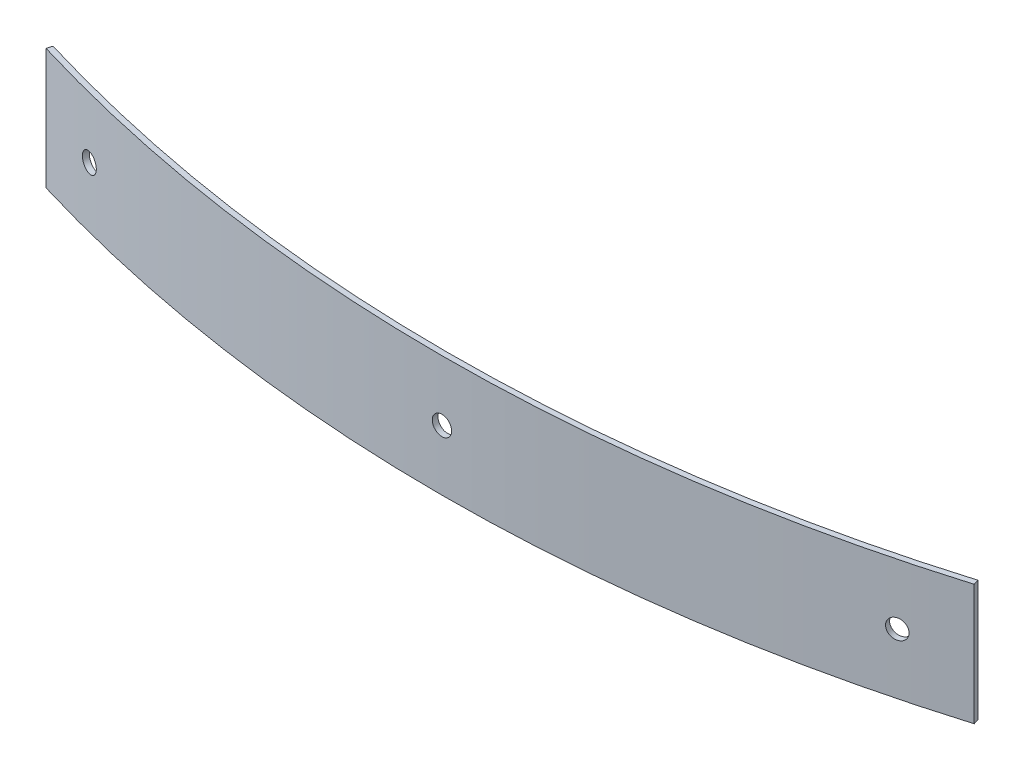
ISO-10303-21;
HEADER;
FILE_DESCRIPTION(('STEP AP214'),'2;1');
FILE_NAME('part.step','',(''),(''),'','','');
FILE_SCHEMA(('AUTOMOTIVE_DESIGN { 1 0 10303 214 1 1 1 1 }'));
ENDSEC;
DATA;
#1=APPLICATION_CONTEXT('core data for automotive mechanical design processes');
#2=APPLICATION_PROTOCOL_DEFINITION('international standard','automotive_design',2000,#1);
#3=PRODUCT_CONTEXT('',#1,'mechanical');
#4=PRODUCT('Part','Part','',(#3));
#5=PRODUCT_RELATED_PRODUCT_CATEGORY('part','',(#4));
#6=PRODUCT_DEFINITION_FORMATION('','',#4);
#7=PRODUCT_DEFINITION_CONTEXT('part definition',#1,'design');
#8=PRODUCT_DEFINITION('design','',#6,#7);
#9=PRODUCT_DEFINITION_SHAPE('','',#8);
#10=(LENGTH_UNIT() NAMED_UNIT(*) SI_UNIT(.MILLI.,.METRE.));
#11=(NAMED_UNIT(*) PLANE_ANGLE_UNIT() SI_UNIT($,.RADIAN.));
#12=(NAMED_UNIT(*) SI_UNIT($,.STERADIAN.) SOLID_ANGLE_UNIT());
#13=UNCERTAINTY_MEASURE_WITH_UNIT(LENGTH_MEASURE(1.E-05),#10,'distance_accuracy_value','');
#14=(GEOMETRIC_REPRESENTATION_CONTEXT(3) GLOBAL_UNCERTAINTY_ASSIGNED_CONTEXT((#13)) GLOBAL_UNIT_ASSIGNED_CONTEXT((#10,
#11,#12)) REPRESENTATION_CONTEXT('',''));
#15=CARTESIAN_POINT('',(0.,0.,0.));
#16=DIRECTION('',(0.,0.,1.));
#17=DIRECTION('',(1.,0.,0.));
#18=AXIS2_PLACEMENT_3D('',#15,#16,#17);
#19=CARTESIAN_POINT('',(0.,379.222,-237.572238635431));
#20=DIRECTION('',(0.,1.,0.));
#21=DIRECTION('',(0.,0.,1.));
#22=AXIS2_PLACEMENT_3D('',#19,#20,#21);
#23=CYLINDRICAL_SURFACE('',#22,253.492);
#24=DIRECTION('',(0.,1.,0.));
#25=VECTOR('',#24,1.);
#26=CARTESIAN_POINT('',(72.9153494369118,379.222,5.20656167566133));
#27=LINE('',#26,#25);
#28=CARTESIAN_POINT('',(72.9153494369118,377.952,5.20656167566136));
#29=VERTEX_POINT('',#28);
#30=CARTESIAN_POINT('',(72.9153494369118,397.002,5.20656167566136));
#31=VERTEX_POINT('',#30);
#32=EDGE_CURVE('E171',#29,#31,#27,.T.);
#33=ORIENTED_EDGE('',*,*,#32,.F.);
#34=CARTESIAN_POINT('',(0.,377.952,-237.572238635431));
#35=DIRECTION('',(0.,1.,0.));
#36=DIRECTION('',(0.,0.,1.));
#37=AXIS2_PLACEMENT_3D('',#34,#35,#36);
#38=CIRCLE('',#37,253.492);
#39=CARTESIAN_POINT('',(-72.9153494369118,377.952,5.2065616756613));
#40=VERTEX_POINT('',#39);
#41=EDGE_CURVE('E46',#29,#40,#38,.F.);
#42=ORIENTED_EDGE('',*,*,#41,.T.);
#43=DIRECTION('',(0.,1.,0.));
#44=VECTOR('',#43,1.);
#45=CARTESIAN_POINT('',(-72.9153494369118,379.222,5.20656167566128));
#46=LINE('',#45,#44);
#47=CARTESIAN_POINT('',(-72.9153494369118,397.002,5.20656167566129));
#48=VERTEX_POINT('',#47);
#49=EDGE_CURVE('E168',#48,#40,#46,.F.);
#50=ORIENTED_EDGE('',*,*,#49,.F.);
#51=CARTESIAN_POINT('',(0.,397.002,-237.572238635431));
#52=DIRECTION('',(0.,1.,0.));
#53=DIRECTION('',(0.,0.,1.));
#54=AXIS2_PLACEMENT_3D('',#51,#52,#53);
#55=CIRCLE('',#54,253.492);
#56=EDGE_CURVE('E92',#31,#48,#55,.F.);
#57=ORIENTED_EDGE('',*,*,#56,.F.);
#58=EDGE_LOOP('',(#33,#42,#50,#57));
#59=FACE_BOUND('',#58,.T.);
#60=CARTESIAN_POINT('',(61.9927239420261,387.477,8.22258686390276));
#61=CARTESIAN_POINT('',(61.9927276324017,387.39139708093,8.22258597349928));
#62=CARTESIAN_POINT('',(61.9997410726376,387.305732111379,8.22081738039946));
#63=CARTESIAN_POINT('',(62.0276208205093,387.136761487185,8.21378317638302));
#64=CARTESIAN_POINT('',(62.0485037971088,387.053458797391,8.2085133575505));
#65=CARTESIAN_POINT('',(62.1035253656771,386.891685141121,8.19461633429835));
#66=CARTESIAN_POINT('',(62.1376576200432,386.813211885316,8.18599073506389));
#67=CARTESIAN_POINT('',(62.2181960158537,386.663311563657,8.16561328312497));
#68=CARTESIAN_POINT('',(62.2645991075236,386.591882753035,8.15386220721735));
#69=CARTESIAN_POINT('',(62.3683668540975,386.458065414065,8.12754511857903));
#70=CARTESIAN_POINT('',(62.4257327791689,386.395677934731,8.11297877966625));
#71=CARTESIAN_POINT('',(62.5497913954779,386.281722566038,8.08142355628616));
#72=CARTESIAN_POINT('',(62.616484453025,386.230155101819,8.06443457667265));
#73=CARTESIAN_POINT('',(62.7572963259186,386.139307020066,8.02849648899902));
#74=CARTESIAN_POINT('',(62.831415059135,386.100026266657,8.00954740261817));
#75=CARTESIAN_POINT('',(62.9849702773748,386.034866079362,7.9702095451716));
#76=CARTESIAN_POINT('',(63.0644067512782,386.008986617453,7.94982077711642));
#77=CARTESIAN_POINT('',(63.2263385727789,385.971363790488,7.90817027727855));
#78=CARTESIAN_POINT('',(63.3088338887046,385.959620279108,7.88690855453432));
#79=CARTESIAN_POINT('',(63.4745406703869,385.950602284758,7.84410978566991));
#80=CARTESIAN_POINT('',(63.5577521347898,385.953327774444,7.82257274007012));
#81=CARTESIAN_POINT('',(63.7225284829729,385.973170212463,7.77983629795129));
#82=CARTESIAN_POINT('',(63.804093387423,385.990286980022,7.75863689719434));
#83=CARTESIAN_POINT('',(63.9632645829819,386.038425824335,7.7171855477871));
#84=CARTESIAN_POINT('',(64.0408708697292,386.06944791641,7.69693360018068));
#85=CARTESIAN_POINT('',(64.1899259961113,386.144516989797,7.6579662856998));
#86=CARTESIAN_POINT('',(64.261374797254,386.188564052524,7.63925092843099));
#87=CARTESIAN_POINT('',(64.396091145886,386.288432621804,7.60390695589148));
#88=CARTESIAN_POINT('',(64.4593586958026,386.344254124864,7.58727834000163));
#89=CARTESIAN_POINT('',(64.5759231023959,386.466088040076,7.55660067272226));
#90=CARTESIAN_POINT('',(64.6292197999315,386.532100614852,7.54255166250497));
#91=CARTESIAN_POINT('',(64.724333778936,386.672442206264,7.51745333146019));
#92=CARTESIAN_POINT('',(64.7661510588925,386.746771223995,7.50640401102786));
#93=CARTESIAN_POINT('',(64.8371239029614,386.901635799182,7.48763727706068));
#94=CARTESIAN_POINT('',(64.866279462919,386.982171358675,7.47991986461912));
#95=CARTESIAN_POINT('',(64.9111047543138,387.147162810945,7.46805006376299));
#96=CARTESIAN_POINT('',(64.926774487808,387.231618703125,7.46389767480462));
#97=CARTESIAN_POINT('',(64.9441851619689,387.402051954567,7.45928374611713));
#98=CARTESIAN_POINT('',(64.9459263207558,387.488029289982,7.45882214859053));
#99=CARTESIAN_POINT('',(64.9354312180553,387.659066034583,7.46160364940372));
#100=CARTESIAN_POINT('',(64.923194956613,387.744125443771,7.46484674773154));
#101=CARTESIAN_POINT('',(64.8850909363888,387.910911123984,7.4749393173368));
#102=CARTESIAN_POINT('',(64.8592232757993,387.992637419013,7.48178876263628));
#103=CARTESIAN_POINT('',(64.7945876036131,388.150437630122,7.4988869432243));
#104=CARTESIAN_POINT('',(64.7558195925888,388.226511546451,7.509135678362));
#105=CARTESIAN_POINT('',(64.6664786170076,388.370848529703,7.53272405145869));
#106=CARTESIAN_POINT('',(64.6159055067634,388.439111500215,7.54606372756308));
#107=CARTESIAN_POINT('',(64.5043848162452,388.565887867824,7.57543465449422));
#108=CARTESIAN_POINT('',(64.4434372308788,388.624401260136,7.59146590664214));
#109=CARTESIAN_POINT('',(64.3128912683034,388.730018183873,7.62574387340233));
#110=CARTESIAN_POINT('',(64.2432927782106,388.777121566387,7.64399061692402));
#111=CARTESIAN_POINT('',(64.0974162969539,388.858580285577,7.68216186499263));
#112=CARTESIAN_POINT('',(64.0211383131638,388.892935636325,7.70208636768741));
#113=CARTESIAN_POINT('',(63.8640646076165,388.947922848659,7.7430317769176));
#114=CARTESIAN_POINT('',(63.7832689186839,388.968554809942,7.76405267548674));
#115=CARTESIAN_POINT('',(63.6194501686322,388.995509917093,7.80658437677817));
#116=CARTESIAN_POINT('',(63.536427103739,389.001833038714,7.82809518033054));
#117=CARTESIAN_POINT('',(63.3705112711011,388.999990894353,7.87099249422387));
#118=CARTESIAN_POINT('',(63.2876185010819,388.991825884165,7.89237900675256));
#119=CARTESIAN_POINT('',(63.1243157479922,388.961239734888,7.93442509779223));
#120=CARTESIAN_POINT('',(63.0439057699124,388.938818567146,7.95508467484204));
#121=CARTESIAN_POINT('',(62.8878526658177,388.880356107455,7.99510150858963));
#122=CARTESIAN_POINT('',(62.8122096284681,388.844314562253,8.01445874106424));
#123=CARTESIAN_POINT('',(62.6678463017629,388.759636003756,8.05133649848278));
#124=CARTESIAN_POINT('',(62.5991257415931,388.710999483454,8.06885709527881));
#125=CARTESIAN_POINT('',(62.4705655049818,388.602516501347,8.10158357090452));
#126=CARTESIAN_POINT('',(62.4107250399381,388.542671036027,8.11678965527896));
#127=CARTESIAN_POINT('',(62.3016074925582,388.413446585415,8.14448229776699));
#128=CARTESIAN_POINT('',(62.2523330390394,388.34406523463,8.15696817910802));
#129=CARTESIAN_POINT('',(62.1657508564969,388.197725830386,8.17888646146161));
#130=CARTESIAN_POINT('',(62.1284489347519,388.120764123655,8.1883173806847));
#131=CARTESIAN_POINT('',(62.066941981976,387.961533839718,8.20385823517227));
#132=CARTESIAN_POINT('',(62.0427212534932,387.879271756316,8.20997215088625));
#133=CARTESIAN_POINT('',(62.0145212627474,387.743237997459,8.21708849692003));
#134=CARTESIAN_POINT('',(62.0063575107593,387.690350202,8.2191479597556));
#135=CARTESIAN_POINT('',(61.9954576971487,387.583983017724,8.22189742149953));
#136=CARTESIAN_POINT('',(61.9927216354635,387.530503628914,8.22258742042371));
#137=CARTESIAN_POINT('',(61.9927239420261,387.477,8.22258686390276));
#138=B_SPLINE_CURVE_WITH_KNOTS('',3,(#60,#61,#62,#63,#64,#65,#66,#67,#68,#69,#70,#71,#72,#73,
#74,#75,#76,#77,#78,#79,#80,#81,#82,#83,#84,#85,#86,#87,#88,#89,#90,#91,#92,#93,#94,#95,#96,#97,
#98,#99,#100,#101,#102,#103,#104,#105,#106,#107,#108,#109,#110,#111,#112,#113,#114,#115,#116,
#117,#118,#119,#120,#121,#122,#123,#124,#125,#126,#127,#128,#129,#130,#131,#132,#133,#134,#135,
#136,#137),.UNSPECIFIED.,.T.,.F.,(4,2,2,2,2,2,2,2,2,2,2,2,2,2,2,2,2,2,2,2,2,2,2,2,2,2,2,2,2,2,2,
2,2,2,2,2,2,2,4),(0.,0.256613468823949,0.5135359054224,0.770335597983413,1.02707152584286,
1.28383721749758,1.54061299608307,1.79738593496716,2.05415833692552,2.3109280809616,
2.56769733973802,2.82446337316722,3.0812296894882,3.33799761080642,3.59476545594189,
3.85153739890713,4.10830937569846,4.3650814367439,4.62185345862301,4.87862145946732,
5.13538945948114,5.39215560991694,5.64892174895959,5.90569105693093,6.1624604909397,
6.41923327583203,6.67600577726533,6.93277641328206,7.18954748439262,7.44631402212502,
7.70308107593974,7.95985290421541,8.21661468341956,8.47335364707546,8.73015641330907,
8.98708355418412,9.24370169316502,9.40409052240344,9.56447934978694),.UNSPECIFIED.);
#139=CARTESIAN_POINT('',(61.9927239420261,387.477,8.22258686390276));
#140=VERTEX_POINT('',#139);
#141=EDGE_CURVE('E145',#140,#140,#138,.T.);
#142=ORIENTED_EDGE('',*,*,#141,.T.);
#143=EDGE_LOOP('',(#142));
#144=FACE_BOUND('',#143,.T.);
#145=CARTESIAN_POINT('',(-61.9927239420261,387.477,8.22258686390276));
#146=CARTESIAN_POINT('',(-61.9927276324017,387.39139708093,8.22258597349928));
#147=CARTESIAN_POINT('',(-61.9997410726376,387.305732111379,8.22081738039946));
#148=CARTESIAN_POINT('',(-62.0276208205093,387.136761487185,8.21378317638302));
#149=CARTESIAN_POINT('',(-62.0485037971088,387.053458797391,8.2085133575505));
#150=CARTESIAN_POINT('',(-62.1035253656771,386.891685141121,8.19461633429835));
#151=CARTESIAN_POINT('',(-62.1376576200432,386.813211885316,8.18599073506389));
#152=CARTESIAN_POINT('',(-62.2181960158537,386.663311563657,8.16561328312497));
#153=CARTESIAN_POINT('',(-62.2645991075236,386.591882753035,8.15386220721735));
#154=CARTESIAN_POINT('',(-62.3683668540975,386.458065414065,8.12754511857903));
#155=CARTESIAN_POINT('',(-62.4257327791689,386.395677934731,8.11297877966625));
#156=CARTESIAN_POINT('',(-62.5497913954779,386.281722566038,8.08142355628616));
#157=CARTESIAN_POINT('',(-62.616484453025,386.230155101819,8.06443457667265));
#158=CARTESIAN_POINT('',(-62.7572963259186,386.139307020066,8.02849648899902));
#159=CARTESIAN_POINT('',(-62.831415059135,386.100026266657,8.00954740261817));
#160=CARTESIAN_POINT('',(-62.9849702773748,386.034866079362,7.9702095451716));
#161=CARTESIAN_POINT('',(-63.0644067512782,386.008986617453,7.94982077711642));
#162=CARTESIAN_POINT('',(-63.2263385727789,385.971363790488,7.90817027727855));
#163=CARTESIAN_POINT('',(-63.3088338887046,385.959620279108,7.88690855453432));
#164=CARTESIAN_POINT('',(-63.4745406703869,385.950602284758,7.84410978566991));
#165=CARTESIAN_POINT('',(-63.5577521347898,385.953327774444,7.82257274007012));
#166=CARTESIAN_POINT('',(-63.7225284829729,385.973170212463,7.77983629795129));
#167=CARTESIAN_POINT('',(-63.804093387423,385.990286980022,7.75863689719434));
#168=CARTESIAN_POINT('',(-63.9632645829819,386.038425824335,7.7171855477871));
#169=CARTESIAN_POINT('',(-64.0408708697292,386.06944791641,7.69693360018068));
#170=CARTESIAN_POINT('',(-64.1899259961113,386.144516989797,7.6579662856998));
#171=CARTESIAN_POINT('',(-64.261374797254,386.188564052524,7.63925092843099));
#172=CARTESIAN_POINT('',(-64.396091145886,386.288432621804,7.60390695589148));
#173=CARTESIAN_POINT('',(-64.4593586958026,386.344254124864,7.58727834000163));
#174=CARTESIAN_POINT('',(-64.5759231023959,386.466088040076,7.55660067272226));
#175=CARTESIAN_POINT('',(-64.6292197999315,386.532100614852,7.54255166250497));
#176=CARTESIAN_POINT('',(-64.724333778936,386.672442206264,7.51745333146019));
#177=CARTESIAN_POINT('',(-64.7661510588925,386.746771223995,7.50640401102786));
#178=CARTESIAN_POINT('',(-64.8371239029614,386.901635799182,7.48763727706068));
#179=CARTESIAN_POINT('',(-64.866279462919,386.982171358675,7.47991986461912));
#180=CARTESIAN_POINT('',(-64.9111047543138,387.147162810945,7.46805006376299));
#181=CARTESIAN_POINT('',(-64.926774487808,387.231618703125,7.46389767480462));
#182=CARTESIAN_POINT('',(-64.9441851619689,387.402051954567,7.45928374611713));
#183=CARTESIAN_POINT('',(-64.9459263207558,387.488029289982,7.45882214859053));
#184=CARTESIAN_POINT('',(-64.9354312180553,387.659066034583,7.46160364940372));
#185=CARTESIAN_POINT('',(-64.923194956613,387.744125443771,7.46484674773154));
#186=CARTESIAN_POINT('',(-64.8850909363888,387.910911123984,7.4749393173368));
#187=CARTESIAN_POINT('',(-64.8592232757993,387.992637419013,7.48178876263628));
#188=CARTESIAN_POINT('',(-64.7945876036131,388.150437630122,7.4988869432243));
#189=CARTESIAN_POINT('',(-64.7558195925888,388.226511546451,7.509135678362));
#190=CARTESIAN_POINT('',(-64.6664786170076,388.370848529703,7.53272405145869));
#191=CARTESIAN_POINT('',(-64.6159055067634,388.439111500215,7.54606372756308));
#192=CARTESIAN_POINT('',(-64.5043848162452,388.565887867824,7.57543465449422));
#193=CARTESIAN_POINT('',(-64.4434372308788,388.624401260136,7.59146590664214));
#194=CARTESIAN_POINT('',(-64.3128912683034,388.730018183873,7.62574387340233));
#195=CARTESIAN_POINT('',(-64.2432927782106,388.777121566387,7.64399061692402));
#196=CARTESIAN_POINT('',(-64.0974162969539,388.858580285577,7.68216186499263));
#197=CARTESIAN_POINT('',(-64.0211383131638,388.892935636325,7.70208636768741));
#198=CARTESIAN_POINT('',(-63.8640646076165,388.947922848659,7.7430317769176));
#199=CARTESIAN_POINT('',(-63.7832689186839,388.968554809942,7.76405267548674));
#200=CARTESIAN_POINT('',(-63.6194501686322,388.995509917093,7.80658437677817));
#201=CARTESIAN_POINT('',(-63.536427103739,389.001833038714,7.82809518033054));
#202=CARTESIAN_POINT('',(-63.3705112711011,388.999990894353,7.87099249422387));
#203=CARTESIAN_POINT('',(-63.2876185010819,388.991825884165,7.89237900675256));
#204=CARTESIAN_POINT('',(-63.1243157479922,388.961239734888,7.93442509779223));
#205=CARTESIAN_POINT('',(-63.0439057699124,388.938818567146,7.95508467484204));
#206=CARTESIAN_POINT('',(-62.8878526658177,388.880356107455,7.99510150858963));
#207=CARTESIAN_POINT('',(-62.8122096284681,388.844314562253,8.01445874106424));
#208=CARTESIAN_POINT('',(-62.6678463017629,388.759636003756,8.05133649848278));
#209=CARTESIAN_POINT('',(-62.5991257415931,388.710999483454,8.06885709527881));
#210=CARTESIAN_POINT('',(-62.4705655049818,388.602516501347,8.10158357090452));
#211=CARTESIAN_POINT('',(-62.4107250399381,388.542671036027,8.11678965527896));
#212=CARTESIAN_POINT('',(-62.3016074925582,388.413446585415,8.14448229776699));
#213=CARTESIAN_POINT('',(-62.2523330390394,388.34406523463,8.15696817910802));
#214=CARTESIAN_POINT('',(-62.1657508564969,388.197725830386,8.17888646146161));
#215=CARTESIAN_POINT('',(-62.1284489347519,388.120764123655,8.1883173806847));
#216=CARTESIAN_POINT('',(-62.066941981976,387.961533839718,8.20385823517227));
#217=CARTESIAN_POINT('',(-62.0427212534932,387.879271756316,8.20997215088625));
#218=CARTESIAN_POINT('',(-62.0145212627474,387.743237997459,8.21708849692003));
#219=CARTESIAN_POINT('',(-62.0063575107593,387.690350202,8.2191479597556));
#220=CARTESIAN_POINT('',(-61.9954576971487,387.583983017724,8.22189742149953));
#221=CARTESIAN_POINT('',(-61.9927216354635,387.530503628914,8.22258742042371));
#222=CARTESIAN_POINT('',(-61.9927239420261,387.477,8.22258686390276));
#223=B_SPLINE_CURVE_WITH_KNOTS('',3,(#145,#146,#147,#148,#149,#150,#151,#152,#153,#154,#155,
#156,#157,#158,#159,#160,#161,#162,#163,#164,#165,#166,#167,#168,#169,#170,#171,#172,#173,#174,
#175,#176,#177,#178,#179,#180,#181,#182,#183,#184,#185,#186,#187,#188,#189,#190,#191,#192,#193,
#194,#195,#196,#197,#198,#199,#200,#201,#202,#203,#204,#205,#206,#207,#208,#209,#210,#211,#212,
#213,#214,#215,#216,#217,#218,#219,#220,#221,#222),.UNSPECIFIED.,.T.,.F.,(4,2,2,2,2,2,2,2,2,2,2,
2,2,2,2,2,2,2,2,2,2,2,2,2,2,2,2,2,2,2,2,2,2,2,2,2,2,2,4),(0.,0.256613468823949,0.5135359054224,
0.770335597983413,1.02707152584286,1.28383721749758,1.54061299608307,1.79738593496716,
2.05415833692552,2.3109280809616,2.56769733973802,2.82446337316722,3.0812296894882,
3.33799761080642,3.59476545594189,3.85153739890713,4.10830937569846,4.3650814367439,
4.62185345862301,4.87862145946732,5.13538945948114,5.39215560991694,5.64892174895959,
5.90569105693093,6.1624604909397,6.41923327583203,6.67600577726533,6.93277641328206,
7.18954748439262,7.44631402212502,7.70308107593974,7.95985290421541,8.21661468341956,
8.47335364707546,8.73015641330907,8.98708355418412,9.24370169316502,9.40409052240344,
9.56447934978694),.UNSPECIFIED.);
#224=CARTESIAN_POINT('',(-61.9927239420261,387.477,8.22258686390276));
#225=VERTEX_POINT('',#224);
#226=EDGE_CURVE('E140',#225,#225,#223,.T.);
#227=ORIENTED_EDGE('',*,*,#226,.F.);
#228=EDGE_LOOP('',(#227));
#229=FACE_BOUND('',#228,.T.);
#230=CARTESIAN_POINT('',(1.52399999999998,387.477,15.9151801608481));
#231=CARTESIAN_POINT('',(1.52399620423233,387.39139708093,15.9151802228024));
#232=CARTESIAN_POINT('',(1.51676333826947,387.305732111379,15.9152239887607));
#233=CARTESIAN_POINT('',(1.48801040212297,387.136761487185,15.9153943721254));
#234=CARTESIAN_POINT('',(1.4664731403435,387.053458797391,15.9155210892231));
#235=CARTESIAN_POINT('',(1.409724601826,386.891685141122,15.9158430195145));
#236=CARTESIAN_POINT('',(1.37451986272938,386.813211885316,15.9160381999553));
#237=CARTESIAN_POINT('',(1.29144469836649,386.663311563657,15.9164750218133));
#238=CARTESIAN_POINT('',(1.24357742022663,386.591882753035,15.9167166516819));
#239=CARTESIAN_POINT('',(1.13652564847377,386.458065414065,15.917219193223));
#240=CARTESIAN_POINT('',(1.07733984348172,386.395677934731,15.9174801071276));
#241=CARTESIAN_POINT('',(0.949331989875766,386.281722566038,15.917991788925));
#242=CARTESIAN_POINT('',(0.880509562797477,386.230155101819,15.9182425564188));
#243=CARTESIAN_POINT('',(0.735184701780867,386.139307020066,15.9187056589439));
#244=CARTESIAN_POINT('',(0.658682352784699,386.100026266657,15.9189179944001));
#245=CARTESIAN_POINT('',(0.500168817671108,386.034866079362,15.9192802967012));
#246=CARTESIAN_POINT('',(0.418157643073287,386.008986617453,15.9194302636764));
#247=CARTESIAN_POINT('',(0.250955279866921,385.971363790488,15.9196509206617));
#248=CARTESIAN_POINT('',(0.165764124184371,385.959620279108,15.9197216114924));
#249=CARTESIAN_POINT('',(-0.00538046141779375,385.950602284758,15.9197757490747));
#250=CARTESIAN_POINT('',(-0.0913338898965094,385.953327774444,15.9197591959911));
#251=CARTESIAN_POINT('',(-0.261562073131037,385.973170212463,15.9196407131218));
#252=CARTESIAN_POINT('',(-0.345836848959557,385.990286980022,15.9195387844084));
#253=CARTESIAN_POINT('',(-0.51031665538873,386.038425824335,15.9192610428787));
#254=CARTESIAN_POINT('',(-0.590521681505442,386.06944791641,15.919085229981));
#255=CARTESIAN_POINT('',(-0.74458568675624,386.144516989797,15.9186795395623));
#256=CARTESIAN_POINT('',(-0.818444626219262,386.188564052524,15.9184496617034));
#257=CARTESIAN_POINT('',(-0.957719365255382,386.288432621804,15.9179617580043));
#258=CARTESIAN_POINT('',(-1.02313516733354,386.344254124864,15.9177037321725));
#259=CARTESIAN_POINT('',(-1.14366779698678,386.466088040076,15.9171886175792));
#260=CARTESIAN_POINT('',(-1.19878446018098,386.532100614852,15.9169315288327));
#261=CARTESIAN_POINT('',(-1.29715295474985,386.672442206264,15.916447277303));
#262=CARTESIAN_POINT('',(-1.3404047845615,386.746771223995,15.9162201145238));
#263=CARTESIAN_POINT('',(-1.41381579100447,386.901635799182,15.9158213263015));
#264=CARTESIAN_POINT('',(-1.44397496333973,386.982171358675,15.9156497008767));
#265=CARTESIAN_POINT('',(-1.49034442421933,387.147162810946,15.9153813378273));
#266=CARTESIAN_POINT('',(-1.50655471489135,387.231618703125,15.9152846001912));
#267=CARTESIAN_POINT('',(-1.52456605348111,387.402051954567,15.9151769206865));
#268=CARTESIAN_POINT('',(-1.52636732704276,387.488029289982,15.9151659774745));
#269=CARTESIAN_POINT('',(-1.5155100859428,387.659066034583,15.9152311170667));
#270=CARTESIAN_POINT('',(-1.50285157132795,387.744125443771,15.9153071998708));
#271=CARTESIAN_POINT('',(-1.46343427644028,387.910911123984,15.9155378125813));
#272=CARTESIAN_POINT('',(-1.43667559773661,387.992637419013,15.9156923419226));
#273=CARTESIAN_POINT('',(-1.36981768170035,388.150437630122,15.9160624252496));
#274=CARTESIAN_POINT('',(-1.32971844495971,388.226511546451,15.9162779792326));
#275=CARTESIAN_POINT('',(-1.23731713331003,388.370848529703,15.9167458131582));
#276=CARTESIAN_POINT('',(-1.18501490780344,388.439111500215,15.9169980935541));
#277=CARTESIAN_POINT('',(-1.0696925216208,388.565887867824,15.9175109362141));
#278=CARTESIAN_POINT('',(-1.00667235568378,388.624401260136,15.9177714984823));
#279=CARTESIAN_POINT('',(-0.871702072599164,388.730018183873,15.9182715324792));
#280=CARTESIAN_POINT('',(-0.799751838924956,388.777121566387,15.9185110039327));
#281=CARTESIAN_POINT('',(-0.648964550563456,388.858580285577,15.9189418537121));
#282=CARTESIAN_POINT('',(-0.570127503478817,388.892935636325,15.9191332320912));
#283=CARTESIAN_POINT('',(-0.407805054358622,388.947922848659,15.9194463183899));
#284=CARTESIAN_POINT('',(-0.32431968609688,388.968554809942,15.9195680268156));
#285=CARTESIAN_POINT('',(-0.155069862242818,388.995509917093,15.9197280537601));
#286=CARTESIAN_POINT('',(-0.0693054027888598,389.001833038714,15.9197663721374));
#287=CARTESIAN_POINT('',(0.102066248707377,388.999990894353,15.9197552985132));
#288=CARTESIAN_POINT('',(0.187673443499529,388.991825884165,15.9197059080603));
#289=CARTESIAN_POINT('',(0.356302119015537,388.961239734888,15.9195249879067));
#290=CARTESIAN_POINT('',(0.439323594541947,388.938818567146,15.9193934580411));
#291=CARTESIAN_POINT('',(0.600425454040831,388.880356107455,15.9190630843733));
#292=CARTESIAN_POINT('',(0.678505746107359,388.844314562253,15.9188642393196));
#293=CARTESIAN_POINT('',(0.82750421326614,388.759636003756,15.918421662821));
#294=CARTESIAN_POINT('',(0.898422668536785,388.710999483454,15.9181779331332));
#295=CARTESIAN_POINT('',(1.03108201335827,388.602516501347,15.9176730807241));
#296=CARTESIAN_POINT('',(1.09282371785679,388.542671036027,15.9174119595504));
#297=CARTESIAN_POINT('',(1.20539929781496,388.413446585415,15.9169016740756));
#298=CARTESIAN_POINT('',(1.25623045874092,388.34406523463,15.9166525127621));
#299=CARTESIAN_POINT('',(1.34554269409277,388.197725830386,15.9161941988879));
#300=CARTESIAN_POINT('',(1.3840177752051,388.120764123655,15.9159850657625));
#301=CARTESIAN_POINT('',(1.44745670561147,387.961533839718,15.9156307962788));
#302=CARTESIAN_POINT('',(1.47243674898164,387.879271756316,15.915485583255));
#303=CARTESIAN_POINT('',(1.50152029422968,387.743237997459,15.9153145430784));
#304=CARTESIAN_POINT('',(1.5099396597667,387.690350202,15.9152643669072));
#305=CARTESIAN_POINT('',(1.52118069883688,387.583983017724,15.9151971564309));
#306=CARTESIAN_POINT('',(1.52400237243478,387.530503628914,15.9151801221254));
#307=CARTESIAN_POINT('',(1.52399999999998,387.477,15.9151801608481));
#308=B_SPLINE_CURVE_WITH_KNOTS('',3,(#230,#231,#232,#233,#234,#235,#236,#237,#238,#239,#240,
#241,#242,#243,#244,#245,#246,#247,#248,#249,#250,#251,#252,#253,#254,#255,#256,#257,#258,#259,
#260,#261,#262,#263,#264,#265,#266,#267,#268,#269,#270,#271,#272,#273,#274,#275,#276,#277,#278,
#279,#280,#281,#282,#283,#284,#285,#286,#287,#288,#289,#290,#291,#292,#293,#294,#295,#296,#297,
#298,#299,#300,#301,#302,#303,#304,#305,#306,#307),.UNSPECIFIED.,.T.,.F.,(4,2,2,2,2,2,2,2,2,2,2,
2,2,2,2,2,2,2,2,2,2,2,2,2,2,2,2,2,2,2,2,2,2,2,2,2,2,2,4),(0.,0.256613468823949,0.5135359054224,
0.770335597983351,1.02707152584286,1.28383721749758,1.54061299608307,1.79738593496716,
2.05415833692552,2.3109280809616,2.56769733973802,2.82446337316722,3.0812296894882,
3.33799761080641,3.59476545594189,3.85153739890712,4.10830937569846,4.36508143674396,
4.62185345862301,4.87862145946726,5.13538945948113,5.392155609917,5.64892174895958,
5.90569105693093,6.16246049093969,6.41923327583203,6.67600577726533,6.93277641328205,
7.18954748439263,7.44631402212501,7.70308107593975,7.95985290421541,8.21661468341955,
8.47335364707546,8.73015641330907,8.98708355418412,9.24370169316502,9.40409052240344,
9.56447934978693),.UNSPECIFIED.);
#309=CARTESIAN_POINT('',(1.52399999999998,387.477,15.9151801608481));
#310=VERTEX_POINT('',#309);
#311=EDGE_CURVE('E84',#310,#310,#308,.T.);
#312=ORIENTED_EDGE('',*,*,#311,.F.);
#313=EDGE_LOOP('',(#312));
#314=FACE_BOUND('',#313,.T.);
#315=ADVANCED_FACE('F32',(#59,#144,#229,#314),#23,.F.);
#316=CARTESIAN_POINT('',(0.,379.222,-237.572238635431));
#317=DIRECTION('',(0.,1.,0.));
#318=DIRECTION('',(0.,0.,1.));
#319=AXIS2_PLACEMENT_3D('',#316,#317,#318);
#320=CYLINDRICAL_SURFACE('',#319,254.381);
#321=CARTESIAN_POINT('',(62.2153157743359,387.477,9.08328561671268));
#322=CARTESIAN_POINT('',(62.2153194646592,387.562602924861,9.08328472609913));
#323=CARTESIAN_POINT('',(62.2223328675429,387.648267900345,9.08151598467601));
#324=CARTESIAN_POINT('',(62.2502124702939,387.817238536637,9.07448120315445));
#325=CARTESIAN_POINT('',(62.2710953390756,387.900541232591,9.06921095479323));
#326=CARTESIAN_POINT('',(62.3261166345618,388.062314901211,9.0553128400932));
#327=CARTESIAN_POINT('',(62.3602487237341,388.140788163192,9.04668657903982));
#328=CARTESIAN_POINT('',(62.4407867509998,388.290688495978,9.02630764562421));
#329=CARTESIAN_POINT('',(62.4871896393127,388.362117311559,9.01455575010206));
#330=CARTESIAN_POINT('',(62.5909569602382,388.495934652938,8.98823695750805));
#331=CARTESIAN_POINT('',(62.6483226621534,388.558322130434,8.97366973446819));
#332=CARTESIAN_POINT('',(62.7723808407174,388.672277494122,8.94211277723668));
#333=CARTESIAN_POINT('',(62.8390736836744,388.723844955177,8.92512294790058));
#334=CARTESIAN_POINT('',(62.9798851561776,388.814693026775,8.88918329204626));
#335=CARTESIAN_POINT('',(63.0540037032011,388.853973773843,8.87023348730936));
#336=CARTESIAN_POINT('',(63.207558601564,388.91913394894,8.83089440470523));
#337=CARTESIAN_POINT('',(63.2869949417862,388.945013404984,8.81050512984729));
#338=CARTESIAN_POINT('',(63.4489265705066,388.98263622301,8.7688538832995));
#339=CARTESIAN_POINT('',(63.5314218275939,388.994379730106,8.74759192057069));
#340=CARTESIAN_POINT('',(63.6971285670277,389.003397715068,8.70479296715228));
#341=CARTESIAN_POINT('',(63.7803400480207,389.00067222027,8.68325597698235));
#342=CARTESIAN_POINT('',(63.9451165110295,388.980829770351,8.64051993278739));
#343=CARTESIAN_POINT('',(64.0266815135658,388.963712994706,8.61932087455129));
#344=CARTESIAN_POINT('',(64.1858529686271,388.915574130764,8.57787046049907));
#345=CARTESIAN_POINT('',(64.2634594167918,388.88455202715,8.5576191057268));
#346=CARTESIAN_POINT('',(64.41251490769,388.809482929059,8.51865316130513));
#347=CARTESIAN_POINT('',(64.4839639122141,388.765435853765,8.49993858119203));
#348=CARTESIAN_POINT('',(64.6186806896242,388.665567257648,8.46459625889678));
#349=CARTESIAN_POINT('',(64.6819484649435,388.609745740328,8.4479685160939));
#350=CARTESIAN_POINT('',(64.7985133116089,388.487911802654,8.41729259444208));
#351=CARTESIAN_POINT('',(64.8518102249146,388.4218992208,8.40324445648053));
#352=CARTESIAN_POINT('',(64.9469246080752,388.281557617525,8.37814776903132));
#353=CARTESIAN_POINT('',(64.988742076418,388.20722859501,8.36709921993879));
#354=CARTESIAN_POINT('',(65.0597152478776,388.052364013317,8.34833384096386));
#355=CARTESIAN_POINT('',(65.0888709468726,387.971828452119,8.34061701216604));
#356=CARTESIAN_POINT('',(65.1336964510311,387.806836999288,8.32874812516355));
#357=CARTESIAN_POINT('',(65.1493662582414,387.722381108248,8.32459606641781));
#358=CARTESIAN_POINT('',(65.1667770066277,387.55194785203,8.31998250736865));
#359=CARTESIAN_POINT('',(65.1685181644032,387.465970510531,8.31952094967556));
#360=CARTESIAN_POINT('',(65.1580229817321,387.294933755574,8.32230223617151));
#361=CARTESIAN_POINT('',(65.1457866413261,387.209874342113,8.32554508034983));
#362=CARTESIAN_POINT('',(65.1076823918261,387.043088650927,8.33563687693339));
#363=CARTESIAN_POINT('',(65.0818145802358,386.961362349366,8.34248580354493));
#364=CARTESIAN_POINT('',(65.0171785496984,386.803562128135,8.359582741041));
#365=CARTESIAN_POINT('',(64.9784103313313,386.727488208211,8.36983075177267));
#366=CARTESIAN_POINT('',(64.8890689104478,386.583151228086,8.39341755136631));
#367=CARTESIAN_POINT('',(64.8384955632714,386.514888263615,8.40675637810309));
#368=CARTESIAN_POINT('',(64.7269743921121,386.38811191141,8.43612557812662));
#369=CARTESIAN_POINT('',(64.6660265630431,386.329598528457,8.45215595273293));
#370=CARTESIAN_POINT('',(64.5354801389558,386.223981631746,8.48643223378676));
#371=CARTESIAN_POINT('',(64.4658814318219,386.176878265887,8.50467816894792));
#372=CARTESIAN_POINT('',(64.3200045623316,386.095419580943,8.54284796201714));
#373=CARTESIAN_POINT('',(64.2437264073466,386.061064247791,8.56277181807344));
#374=CARTESIAN_POINT('',(64.086652420526,386.006077069289,8.60371616970623));
#375=CARTESIAN_POINT('',(64.0058566212975,385.985445124903,8.62473665736747));
#376=CARTESIAN_POINT('',(63.8420377269332,385.958490051868,8.66726781812187));
#377=CARTESIAN_POINT('',(63.7590146280218,385.952166947477,8.68877849204593));
#378=CARTESIAN_POINT('',(63.5930987976947,385.954009126087,8.73167584510261));
#379=CARTESIAN_POINT('',(63.5102060640172,385.962174154883,8.75306252640413));
#380=CARTESIAN_POINT('',(63.3469034583966,385.992760343916,8.79510923214577));
#381=CARTESIAN_POINT('',(63.2664935914442,386.015181532806,8.81576925512527));
#382=CARTESIAN_POINT('',(63.1104407718142,386.073644037084,8.85578720764192));
#383=CARTESIAN_POINT('',(63.034797907804,386.109685605726,8.87514511295984));
#384=CARTESIAN_POINT('',(62.8904349712601,386.194364212845,8.91202436687896));
#385=CARTESIAN_POINT('',(62.8217146279045,386.243000758318,8.92954578732795));
#386=CARTESIAN_POINT('',(62.6931548523341,386.351483785443,8.9622739660329));
#387=CARTESIAN_POINT('',(62.6333146305387,386.411329269375,8.97748093008301));
#388=CARTESIAN_POINT('',(62.5241975624265,386.54055375442,9.00517529068711));
#389=CARTESIAN_POINT('',(62.4749233449281,386.609935121028,9.0176620104575));
#390=CARTESIAN_POINT('',(62.3883416043812,386.756274549476,9.03958183308036));
#391=CARTESIAN_POINT('',(62.3510398880259,386.833236264229,9.04901345422269));
#392=CARTESIAN_POINT('',(62.2895332907564,386.992466559019,9.06455549585866));
#393=CARTESIAN_POINT('',(62.2653127124332,387.074728645249,9.07066989706729));
#394=CARTESIAN_POINT('',(62.2371129217041,387.210762340616,9.07778680910847));
#395=CARTESIAN_POINT('',(62.2289492344837,387.263650069914,9.07984643645406));
#396=CARTESIAN_POINT('',(62.2180495075674,387.370017119448,9.08259611857405));
#397=CARTESIAN_POINT('',(62.2153134678092,387.423496439677,9.08328617336417));
#398=CARTESIAN_POINT('',(62.2153157743359,387.477,9.08328561671268));
#399=B_SPLINE_CURVE_WITH_KNOTS('',3,(#321,#322,#323,#324,#325,#326,#327,#328,#329,#330,#331,
#332,#333,#334,#335,#336,#337,#338,#339,#340,#341,#342,#343,#344,#345,#346,#347,#348,#349,#350,
#351,#352,#353,#354,#355,#356,#357,#358,#359,#360,#361,#362,#363,#364,#365,#366,#367,#368,#369,
#370,#371,#372,#373,#374,#375,#376,#377,#378,#379,#380,#381,#382,#383,#384,#385,#386,#387,#388,
#389,#390,#391,#392,#393,#394,#395,#396,#397,#398),.UNSPECIFIED.,.T.,.F.,(4,2,2,2,2,2,2,2,2,2,2,
2,2,2,2,2,2,2,2,2,2,2,2,2,2,2,2,2,2,2,2,2,2,2,2,2,2,2,4),(0.,0.256613486448833,
0.513535941351615,0.770335653039571,1.02707159969429,1.28383728992207,1.54061306704111,
1.79738599090298,2.05415837798277,2.31092812910049,2.56769739511603,2.82446345895688,
3.08122980560701,3.33799774547446,3.59476560896546,3.85153754194027,4.10830950873929,
4.36508155912531,4.62185357053768,4.87862158897104,5.13538960666048,5.39215578775586,
5.64892195730352,5.90569127342515,6.16246071542994,6.41923348551942,6.67600597223637,
6.93277660588117,7.1895476748124,7.44631423858082,7.70308131843338,7.95985317280622,
8.21661497788283,8.47335393915537,8.73015670307302,8.98708382942802,9.24370195344737,
9.40409057722206,9.56447919915476),.UNSPECIFIED.);
#400=CARTESIAN_POINT('',(62.2153157743359,387.477,9.08328561671268));
#401=VERTEX_POINT('',#400);
#402=EDGE_CURVE('E133',#401,#401,#399,.T.);
#403=ORIENTED_EDGE('',*,*,#402,.T.);
#404=EDGE_LOOP('',(#403));
#405=FACE_BOUND('',#404,.T.);
#406=CARTESIAN_POINT('',(-62.2153157743359,387.477,9.08328561671268));
#407=CARTESIAN_POINT('',(-62.2153194646592,387.562602924861,9.08328472609913));
#408=CARTESIAN_POINT('',(-62.2223328675429,387.648267900345,9.08151598467601));
#409=CARTESIAN_POINT('',(-62.2502124702939,387.817238536637,9.07448120315445));
#410=CARTESIAN_POINT('',(-62.2710953390756,387.900541232591,9.06921095479323));
#411=CARTESIAN_POINT('',(-62.3261166345618,388.062314901211,9.0553128400932));
#412=CARTESIAN_POINT('',(-62.3602487237341,388.140788163192,9.04668657903982));
#413=CARTESIAN_POINT('',(-62.4407867509998,388.290688495978,9.02630764562421));
#414=CARTESIAN_POINT('',(-62.4871896393127,388.362117311559,9.01455575010206));
#415=CARTESIAN_POINT('',(-62.5909569602382,388.495934652938,8.98823695750805));
#416=CARTESIAN_POINT('',(-62.6483226621534,388.558322130434,8.97366973446819));
#417=CARTESIAN_POINT('',(-62.7723808407174,388.672277494122,8.94211277723668));
#418=CARTESIAN_POINT('',(-62.8390736836744,388.723844955177,8.92512294790058));
#419=CARTESIAN_POINT('',(-62.9798851561776,388.814693026775,8.88918329204626));
#420=CARTESIAN_POINT('',(-63.0540037032011,388.853973773843,8.87023348730936));
#421=CARTESIAN_POINT('',(-63.207558601564,388.91913394894,8.83089440470523));
#422=CARTESIAN_POINT('',(-63.2869949417862,388.945013404984,8.81050512984729));
#423=CARTESIAN_POINT('',(-63.4489265705066,388.98263622301,8.7688538832995));
#424=CARTESIAN_POINT('',(-63.5314218275939,388.994379730106,8.74759192057069));
#425=CARTESIAN_POINT('',(-63.6971285670277,389.003397715068,8.70479296715228));
#426=CARTESIAN_POINT('',(-63.7803400480207,389.00067222027,8.68325597698235));
#427=CARTESIAN_POINT('',(-63.9451165110295,388.980829770351,8.64051993278739));
#428=CARTESIAN_POINT('',(-64.0266815135658,388.963712994706,8.61932087455129));
#429=CARTESIAN_POINT('',(-64.1858529686271,388.915574130764,8.57787046049907));
#430=CARTESIAN_POINT('',(-64.2634594167918,388.88455202715,8.5576191057268));
#431=CARTESIAN_POINT('',(-64.41251490769,388.809482929059,8.51865316130513));
#432=CARTESIAN_POINT('',(-64.4839639122141,388.765435853765,8.49993858119203));
#433=CARTESIAN_POINT('',(-64.6186806896242,388.665567257648,8.46459625889678));
#434=CARTESIAN_POINT('',(-64.6819484649435,388.609745740328,8.4479685160939));
#435=CARTESIAN_POINT('',(-64.7985133116089,388.487911802654,8.41729259444208));
#436=CARTESIAN_POINT('',(-64.8518102249146,388.4218992208,8.40324445648053));
#437=CARTESIAN_POINT('',(-64.9469246080752,388.281557617525,8.37814776903132));
#438=CARTESIAN_POINT('',(-64.988742076418,388.20722859501,8.36709921993879));
#439=CARTESIAN_POINT('',(-65.0597152478776,388.052364013317,8.34833384096386));
#440=CARTESIAN_POINT('',(-65.0888709468726,387.971828452119,8.34061701216604));
#441=CARTESIAN_POINT('',(-65.1336964510311,387.806836999288,8.32874812516355));
#442=CARTESIAN_POINT('',(-65.1493662582414,387.722381108248,8.32459606641781));
#443=CARTESIAN_POINT('',(-65.1667770066277,387.55194785203,8.31998250736865));
#444=CARTESIAN_POINT('',(-65.1685181644032,387.465970510531,8.31952094967556));
#445=CARTESIAN_POINT('',(-65.1580229817321,387.294933755574,8.32230223617151));
#446=CARTESIAN_POINT('',(-65.1457866413261,387.209874342113,8.32554508034983));
#447=CARTESIAN_POINT('',(-65.1076823918261,387.043088650927,8.33563687693339));
#448=CARTESIAN_POINT('',(-65.0818145802358,386.961362349366,8.34248580354493));
#449=CARTESIAN_POINT('',(-65.0171785496984,386.803562128135,8.359582741041));
#450=CARTESIAN_POINT('',(-64.9784103313313,386.727488208211,8.36983075177267));
#451=CARTESIAN_POINT('',(-64.8890689104478,386.583151228086,8.39341755136631));
#452=CARTESIAN_POINT('',(-64.8384955632714,386.514888263615,8.40675637810309));
#453=CARTESIAN_POINT('',(-64.7269743921121,386.38811191141,8.43612557812662));
#454=CARTESIAN_POINT('',(-64.6660265630431,386.329598528457,8.45215595273293));
#455=CARTESIAN_POINT('',(-64.5354801389558,386.223981631746,8.48643223378676));
#456=CARTESIAN_POINT('',(-64.4658814318219,386.176878265887,8.50467816894792));
#457=CARTESIAN_POINT('',(-64.3200045623316,386.095419580943,8.54284796201714));
#458=CARTESIAN_POINT('',(-64.2437264073466,386.061064247791,8.56277181807344));
#459=CARTESIAN_POINT('',(-64.086652420526,386.006077069289,8.60371616970623));
#460=CARTESIAN_POINT('',(-64.0058566212975,385.985445124903,8.62473665736747));
#461=CARTESIAN_POINT('',(-63.8420377269332,385.958490051868,8.66726781812187));
#462=CARTESIAN_POINT('',(-63.7590146280218,385.952166947477,8.68877849204593));
#463=CARTESIAN_POINT('',(-63.5930987976947,385.954009126087,8.73167584510261));
#464=CARTESIAN_POINT('',(-63.5102060640172,385.962174154883,8.75306252640413));
#465=CARTESIAN_POINT('',(-63.3469034583966,385.992760343916,8.79510923214577));
#466=CARTESIAN_POINT('',(-63.2664935914442,386.015181532806,8.81576925512527));
#467=CARTESIAN_POINT('',(-63.1104407718142,386.073644037084,8.85578720764192));
#468=CARTESIAN_POINT('',(-63.034797907804,386.109685605726,8.87514511295984));
#469=CARTESIAN_POINT('',(-62.8904349712601,386.194364212845,8.91202436687896));
#470=CARTESIAN_POINT('',(-62.8217146279045,386.243000758318,8.92954578732795));
#471=CARTESIAN_POINT('',(-62.6931548523341,386.351483785443,8.9622739660329));
#472=CARTESIAN_POINT('',(-62.6333146305387,386.411329269375,8.97748093008301));
#473=CARTESIAN_POINT('',(-62.5241975624265,386.54055375442,9.00517529068711));
#474=CARTESIAN_POINT('',(-62.4749233449281,386.609935121028,9.0176620104575));
#475=CARTESIAN_POINT('',(-62.3883416043812,386.756274549476,9.03958183308036));
#476=CARTESIAN_POINT('',(-62.3510398880259,386.833236264229,9.04901345422269));
#477=CARTESIAN_POINT('',(-62.2895332907564,386.992466559019,9.06455549585866));
#478=CARTESIAN_POINT('',(-62.2653127124332,387.074728645249,9.07066989706729));
#479=CARTESIAN_POINT('',(-62.2371129217041,387.210762340616,9.07778680910847));
#480=CARTESIAN_POINT('',(-62.2289492344837,387.263650069914,9.07984643645406));
#481=CARTESIAN_POINT('',(-62.2180495075674,387.370017119448,9.08259611857405));
#482=CARTESIAN_POINT('',(-62.2153134678092,387.423496439677,9.08328617336417));
#483=CARTESIAN_POINT('',(-62.2153157743359,387.477,9.08328561671268));
#484=B_SPLINE_CURVE_WITH_KNOTS('',3,(#406,#407,#408,#409,#410,#411,#412,#413,#414,#415,#416,
#417,#418,#419,#420,#421,#422,#423,#424,#425,#426,#427,#428,#429,#430,#431,#432,#433,#434,#435,
#436,#437,#438,#439,#440,#441,#442,#443,#444,#445,#446,#447,#448,#449,#450,#451,#452,#453,#454,
#455,#456,#457,#458,#459,#460,#461,#462,#463,#464,#465,#466,#467,#468,#469,#470,#471,#472,#473,
#474,#475,#476,#477,#478,#479,#480,#481,#482,#483),.UNSPECIFIED.,.T.,.F.,(4,2,2,2,2,2,2,2,2,2,2,
2,2,2,2,2,2,2,2,2,2,2,2,2,2,2,2,2,2,2,2,2,2,2,2,2,2,2,4),(0.,0.256613486448833,
0.513535941351615,0.770335653039571,1.02707159969429,1.28383728992207,1.54061306704111,
1.79738599090298,2.05415837798277,2.31092812910049,2.56769739511603,2.82446345895688,
3.08122980560701,3.33799774547446,3.59476560896546,3.85153754194027,4.10830950873929,
4.36508155912531,4.62185357053768,4.87862158897104,5.13538960666048,5.39215578775586,
5.64892195730352,5.90569127342515,6.16246071542994,6.41923348551942,6.67600597223637,
6.93277660588117,7.1895476748124,7.44631423858082,7.70308131843338,7.95985317280622,
8.21661497788283,8.47335393915537,8.73015670307302,8.98708382942802,9.24370195344737,
9.40409057722206,9.56447919915476),.UNSPECIFIED.);
#485=CARTESIAN_POINT('',(-62.2153157743359,387.477,9.08328561671268));
#486=VERTEX_POINT('',#485);
#487=EDGE_CURVE('E106',#486,#486,#484,.T.);
#488=ORIENTED_EDGE('',*,*,#487,.F.);
#489=EDGE_LOOP('',(#488));
#490=FACE_BOUND('',#489,.T.);
#491=CARTESIAN_POINT('',(1.52399999999998,387.477,16.8041961713336));
#492=CARTESIAN_POINT('',(1.52399620423038,387.562602924861,16.8041962330714));
#493=CARTESIAN_POINT('',(1.51676333729276,387.648267900345,16.8042398460786));
#494=CARTESIAN_POINT('',(1.48801039704883,387.817238536637,16.8044096339978));
#495=CARTESIAN_POINT('',(1.4664731321075,387.900541232591,16.8045359082529));
#496=CARTESIAN_POINT('',(1.40972458469701,388.062314901211,16.8048567134873));
#497=CARTESIAN_POINT('',(1.37451983982619,388.140788163192,16.8050512118285));
#498=CARTESIAN_POINT('',(1.29144466133689,388.290688495978,16.8054865071221));
#499=CARTESIAN_POINT('',(1.24357737486164,388.362117311559,16.8057272925662));
#500=CARTESIAN_POINT('',(1.13652558856285,388.495934652938,16.8062280778528));
#501=CARTESIAN_POINT('',(1.07733977825116,388.558322130434,16.806488079918));
#502=CARTESIAN_POINT('',(0.949331914325308,388.672277494122,16.8069979734886));
#503=CARTESIAN_POINT('',(0.880509482248248,388.723844955177,16.8072478645965));
#504=CARTESIAN_POINT('',(0.735184616227624,388.814693026775,16.8077093486414));
#505=CARTESIAN_POINT('',(0.658682267631683,388.853973773843,16.807920942004));
#506=CARTESIAN_POINT('',(0.500168735451229,388.91913394894,16.8082819780808));
#507=CARTESIAN_POINT('',(0.418157563383234,388.945013404984,16.808431420925));
#508=CARTESIAN_POINT('',(0.250955199855536,388.98263622301,16.8086513067165));
#509=CARTESIAN_POINT('',(0.165764041049773,388.994379730106,16.8087217504748));
#510=CARTESIAN_POINT('',(-0.00538054985823179,389.003397715068,16.8087756988034));
#511=CARTESIAN_POINT('',(-0.091333980520044,389.00067222027,16.8087592035379));
#512=CARTESIAN_POINT('',(-0.261562175290635,388.980829770351,16.8086411346677));
#513=CARTESIAN_POINT('',(-0.345836960320729,388.963712994706,16.808539562124));
#514=CARTESIAN_POINT('',(-0.510316783792261,388.915574130764,16.8082627911302));
#515=CARTESIAN_POINT('',(-0.590521817751064,388.88455202715,16.8080875925991));
#516=CARTESIAN_POINT('',(-0.744585832871787,388.809482929059,16.8076833198675));
#517=CARTESIAN_POINT('',(-0.818444774653805,388.765435853765,16.8074542453328));
#518=CARTESIAN_POINT('',(-0.957719515622238,388.665567257648,16.8069680466713));
#519=CARTESIAN_POINT('',(-1.02313531732009,388.609745740328,16.8067109225529));
#520=CARTESIAN_POINT('',(-1.1436679359578,388.487911802654,16.8061976081699));
#521=CARTESIAN_POINT('',(-1.19878458965382,388.4218992208,16.8059414179203));
#522=CARTESIAN_POINT('',(-1.29715306398207,388.281557617525,16.8054588588264));
#523=CARTESIAN_POINT('',(-1.34040488305135,388.20722859501,16.8052324899861));
#524=CARTESIAN_POINT('',(-1.41381586719396,388.052364013317,16.8048350955685));
#525=CARTESIAN_POINT('',(-1.44397502800524,387.971828452119,16.8046640700093));
#526=CARTESIAN_POINT('',(-1.49034446606079,387.806836999288,16.8043966449769));
#527=CARTESIAN_POINT('',(-1.50655474542225,387.722381108248,16.8043002454923));
#528=CARTESIAN_POINT('',(-1.5245660633231,387.55194785203,16.8041929424367));
#529=CARTESIAN_POINT('',(-1.52636732593204,387.465970510531,16.8041820375361));
#530=CARTESIAN_POINT('',(-1.51551006106959,387.294933755574,16.8042469496147));
#531=CARTESIAN_POINT('',(-1.50285153364008,387.209874342113,16.8043227665935));
#532=CARTESIAN_POINT('',(-1.46343421032879,387.043088650927,16.8045525734988));
#533=CARTESIAN_POINT('',(-1.43667551530316,386.961362349366,16.804706562866));
#534=CARTESIAN_POINT('',(-1.36981756357532,386.803562128135,16.8050753529724));
#535=CARTESIAN_POINT('',(-1.32971830747309,386.727488208211,16.805290153709));
#536=CARTESIAN_POINT('',(-1.23731695867876,386.583151228086,16.8057563527566));
#537=CARTESIAN_POINT('',(-1.18501471645145,386.514888263615,16.8060077515162));
#538=CARTESIAN_POINT('',(-1.06969229732046,386.38811191141,16.8065188019318));
#539=CARTESIAN_POINT('',(-1.00667211516223,386.329598528457,16.8067784535918));
#540=CARTESIAN_POINT('',(-0.871701807333066,386.223981631746,16.8072767400227));
#541=CARTESIAN_POINT('',(-0.79975156592838,386.176878265887,16.8075153745211));
#542=CARTESIAN_POINT('',(-0.648964266002107,386.095419580943,16.8079447184404));
#543=CARTESIAN_POINT('',(-0.570127215080849,386.061064247791,16.8081354279141));
#544=CARTESIAN_POINT('',(-0.407804758447903,386.006077069289,16.8084474198772));
#545=CARTESIAN_POINT('',(-0.324319386286503,385.985445124903,16.8085687028676));
#546=CARTESIAN_POINT('',(-0.155069558056205,385.958490051868,16.8087281703594));
#547=CARTESIAN_POINT('',(-0.0693050981239653,385.952166947477,16.8087663547199));
#548=CARTESIAN_POINT('',(0.102066560940811,385.954009126087,16.8087553195902));
#549=CARTESIAN_POINT('',(0.187673762806156,385.962174154883,16.8087061016335));
#550=CARTESIAN_POINT('',(0.356302449459427,385.992760343916,16.8085258135256));
#551=CARTESIAN_POINT('',(0.439323929049883,386.015181532806,16.8083947432098));
#552=CARTESIAN_POINT('',(0.600425793262408,386.073644037084,16.8080655238998));
#553=CARTESIAN_POINT('',(0.678506085977334,386.109685605726,16.8078673736584));
#554=CARTESIAN_POINT('',(0.827504550096162,386.194364212845,16.807426343682));
#555=CARTESIAN_POINT('',(0.898423001684859,386.243000758318,16.8071834656978));
#556=CARTESIAN_POINT('',(1.0310823265677,386.351483785443,16.8066803775563));
#557=CARTESIAN_POINT('',(1.09282401581914,386.411329269375,16.806420168943));
#558=CARTESIAN_POINT('',(1.20539956195731,386.54055375442,16.8059116668573));
#559=CARTESIAN_POINT('',(1.25623070430663,386.609935121028,16.805663376362));
#560=CARTESIAN_POINT('',(1.34554289739412,386.756274549476,16.8052066643627));
#561=CARTESIAN_POINT('',(1.38401795540546,386.833236264229,16.8049982622242));
#562=CARTESIAN_POINT('',(1.44745683886739,386.992466559019,16.804645231087));
#563=CARTESIAN_POINT('',(1.47243685841903,387.074728645249,16.8045005256908));
#564=CARTESIAN_POINT('',(1.50152035173826,387.210762340616,16.8043300835732));
#565=CARTESIAN_POINT('',(1.50993969576063,387.263650069914,16.8042800828885));
#566=CARTESIAN_POINT('',(1.52118070607576,387.370017119448,16.8042131074753));
#567=CARTESIAN_POINT('',(1.52400237243279,387.423496439677,16.8041961327463));
#568=CARTESIAN_POINT('',(1.52399999999998,387.477,16.8041961713336));
#569=B_SPLINE_CURVE_WITH_KNOTS('',3,(#491,#492,#493,#494,#495,#496,#497,#498,#499,#500,#501,
#502,#503,#504,#505,#506,#507,#508,#509,#510,#511,#512,#513,#514,#515,#516,#517,#518,#519,#520,
#521,#522,#523,#524,#525,#526,#527,#528,#529,#530,#531,#532,#533,#534,#535,#536,#537,#538,#539,
#540,#541,#542,#543,#544,#545,#546,#547,#548,#549,#550,#551,#552,#553,#554,#555,#556,#557,#558,
#559,#560,#561,#562,#563,#564,#565,#566,#567,#568),.UNSPECIFIED.,.T.,.F.,(4,2,2,2,2,2,2,2,2,2,2,
2,2,2,2,2,2,2,2,2,2,2,2,2,2,2,2,2,2,2,2,2,2,2,2,2,2,2,4),(0.,0.256613486448833,
0.513535941351615,0.770335653039569,1.02707159969429,1.28383728992207,1.54061306704111,
1.79738599090297,2.05415837798277,2.31092812910051,2.56769739511603,2.82446345895688,
3.08122980560701,3.33799774547442,3.59476560896546,3.85153754194026,4.10830950873929,
4.3650815591253,4.62185357053767,4.87862158897103,5.13538960666048,5.39215578775585,
5.64892195730351,5.90569127342509,6.16246071542993,6.41923348551941,6.67600597223637,
6.93277660588118,7.18954767481239,7.44631423858081,7.70308131843337,7.95985317280621,
8.21661497788282,8.47335393915536,8.73015670307301,8.98708382942813,9.24370195344736,
9.40409057722205,9.56447919915475),.UNSPECIFIED.);
#570=CARTESIAN_POINT('',(1.52399999999998,387.477,16.8041961713336));
#571=VERTEX_POINT('',#570);
#572=EDGE_CURVE('E36',#571,#571,#569,.T.);
#573=ORIENTED_EDGE('',*,*,#572,.F.);
#574=EDGE_LOOP('',(#573));
#575=FACE_BOUND('',#574,.T.);
#576=CARTESIAN_POINT('',(0.,377.952,-237.572238635431));
#577=DIRECTION('',(0.,1.,0.));
#578=DIRECTION('',(0.,0.,1.));
#579=AXIS2_PLACEMENT_3D('',#576,#577,#578);
#580=CIRCLE('',#579,254.381);
#581=CARTESIAN_POINT('',(-73.1710645902477,377.952,6.0579903340669));
#582=VERTEX_POINT('',#581);
#583=CARTESIAN_POINT('',(73.1710645902476,377.952,6.0579903340669));
#584=VERTEX_POINT('',#583);
#585=EDGE_CURVE('E11',#582,#584,#580,.T.);
#586=ORIENTED_EDGE('',*,*,#585,.T.);
#587=DIRECTION('',(0.,1.,0.));
#588=VECTOR('',#587,1.);
#589=CARTESIAN_POINT('',(73.1710645902476,379.222,6.0579903340669));
#590=LINE('',#589,#588);
#591=CARTESIAN_POINT('',(73.1710645902476,397.002,6.0579903340669));
#592=VERTEX_POINT('',#591);
#593=EDGE_CURVE('E83',#584,#592,#590,.T.);
#594=ORIENTED_EDGE('',*,*,#593,.T.);
#595=CARTESIAN_POINT('',(0.,397.002,-237.572238635431));
#596=DIRECTION('',(0.,1.,0.));
#597=DIRECTION('',(0.,0.,1.));
#598=AXIS2_PLACEMENT_3D('',#595,#596,#597);
#599=CIRCLE('',#598,254.381);
#600=CARTESIAN_POINT('',(-73.1710645902477,397.002,6.0579903340669));
#601=VERTEX_POINT('',#600);
#602=EDGE_CURVE('E90',#601,#592,#599,.T.);
#603=ORIENTED_EDGE('',*,*,#602,.F.);
#604=DIRECTION('',(0.,1.,0.));
#605=VECTOR('',#604,1.);
#606=CARTESIAN_POINT('',(-73.1710645902477,379.222,6.0579903340669));
#607=LINE('',#606,#605);
#608=EDGE_CURVE('E73',#601,#582,#607,.F.);
#609=ORIENTED_EDGE('',*,*,#608,.T.);
#610=EDGE_LOOP('',(#586,#594,#603,#609));
#611=FACE_BOUND('',#610,.T.);
#612=ADVANCED_FACE('F94',(#405,#490,#575,#611),#320,.T.);
#613=CARTESIAN_POINT('',(0.,377.952,-237.572238635431));
#614=DIRECTION('',(0.,1.,0.));
#615=DIRECTION('',(0.,0.,1.));
#616=AXIS2_PLACEMENT_3D('',#613,#614,#615);
#617=PLANE('',#616);
#618=ORIENTED_EDGE('',*,*,#41,.F.);
#619=DIRECTION('',(0.287643592053839,0.,0.957737523515898));
#620=VECTOR('',#619,1.);
#621=CARTESIAN_POINT('',(0.,377.952,-237.572238635431));
#622=LINE('',#621,#620);
#623=EDGE_CURVE('E173',#29,#584,#622,.T.);
#624=ORIENTED_EDGE('',*,*,#623,.T.);
#625=ORIENTED_EDGE('',*,*,#585,.F.);
#626=DIRECTION('',(0.287643592053839,0.,-0.957737523515898));
#627=VECTOR('',#626,1.);
#628=CARTESIAN_POINT('',(0.,377.952,-237.572238635431));
#629=LINE('',#628,#627);
#630=EDGE_CURVE('E79',#582,#40,#629,.T.);
#631=ORIENTED_EDGE('',*,*,#630,.T.);
#632=EDGE_LOOP('',(#618,#624,#625,#631));
#633=FACE_BOUND('',#632,.T.);
#634=ADVANCED_FACE('F34',(#633),#617,.F.);
#635=CARTESIAN_POINT('',(0.,397.002,-237.572238635431));
#636=DIRECTION('',(0.,1.,0.));
#637=DIRECTION('',(0.,0.,1.));
#638=AXIS2_PLACEMENT_3D('',#635,#636,#637);
#639=PLANE('',#638);
#640=DIRECTION('',(0.287643592053839,0.,0.957737523515898));
#641=VECTOR('',#640,1.);
#642=CARTESIAN_POINT('',(73.1710645902476,397.002,6.0579903340669));
#643=LINE('',#642,#641);
#644=EDGE_CURVE('E52',#31,#592,#643,.T.);
#645=ORIENTED_EDGE('',*,*,#644,.F.);
#646=ORIENTED_EDGE('',*,*,#56,.T.);
#647=DIRECTION('',(0.287643592053839,0.,-0.957737523515897));
#648=VECTOR('',#647,1.);
#649=CARTESIAN_POINT('',(-54.2195438246466,397.002,-57.0429549548848));
#650=LINE('',#649,#648);
#651=EDGE_CURVE('E76',#601,#48,#650,.T.);
#652=ORIENTED_EDGE('',*,*,#651,.F.);
#653=ORIENTED_EDGE('',*,*,#602,.T.);
#654=EDGE_LOOP('',(#645,#646,#652,#653));
#655=FACE_BOUND('',#654,.T.);
#656=ADVANCED_FACE('F89',(#655),#639,.T.);
#657=CARTESIAN_POINT('',(0.,387.477,-25.4));
#658=DIRECTION('',(0.,0.,1.));
#659=DIRECTION('',(1.,0.,0.));
#660=AXIS2_PLACEMENT_3D('',#657,#658,#659);
#661=CYLINDRICAL_SURFACE('',#660,1.52400000000001);
#662=ORIENTED_EDGE('',*,*,#311,.T.);
#663=EDGE_LOOP('',(#662));
#664=FACE_BOUND('',#663,.T.);
#665=ORIENTED_EDGE('',*,*,#572,.T.);
#666=EDGE_LOOP('',(#665));
#667=FACE_BOUND('',#666,.T.);
#668=ADVANCED_FACE('F113',(#664,#667),#661,.F.);
#669=CARTESIAN_POINT('',(-53.1236859697792,387.477,-32.1581864467977));
#670=DIRECTION('',(-0.250380004054442,0.,0.968147640378108));
#671=DIRECTION('',(0.968147640378108,0.,0.250380004054442));
#672=AXIS2_PLACEMENT_3D('',#669,#670,#671);
#673=CYLINDRICAL_SURFACE('',#672,1.52400000000001);
#674=ORIENTED_EDGE('',*,*,#226,.T.);
#675=EDGE_LOOP('',(#674));
#676=FACE_BOUND('',#675,.T.);
#677=ORIENTED_EDGE('',*,*,#487,.T.);
#678=EDGE_LOOP('',(#677));
#679=FACE_BOUND('',#678,.T.);
#680=ADVANCED_FACE('F116',(#676,#679),#673,.F.);
#681=CARTESIAN_POINT('',(53.1236859697792,387.477,-32.1581864467977));
#682=DIRECTION('',(0.250380004054442,0.,0.968147640378108));
#683=DIRECTION('',(-0.968147640378108,0.,0.250380004054442));
#684=AXIS2_PLACEMENT_3D('',#681,#682,#683);
#685=CYLINDRICAL_SURFACE('',#684,1.52400000000001);
#686=ORIENTED_EDGE('',*,*,#141,.F.);
#687=EDGE_LOOP('',(#686));
#688=FACE_BOUND('',#687,.T.);
#689=ORIENTED_EDGE('',*,*,#402,.F.);
#690=EDGE_LOOP('',(#689));
#691=FACE_BOUND('',#690,.T.);
#692=ADVANCED_FACE('F157',(#688,#691),#685,.F.);
#693=CARTESIAN_POINT('',(73.1710645902476,0.,6.0579903340669));
#694=DIRECTION('',(-0.957737523515898,0.,0.287643592053839));
#695=DIRECTION('',(0.287643592053839,0.,0.957737523515898));
#696=AXIS2_PLACEMENT_3D('',#693,#694,#695);
#697=PLANE('',#696);
#698=ORIENTED_EDGE('',*,*,#32,.T.);
#699=ORIENTED_EDGE('',*,*,#644,.T.);
#700=ORIENTED_EDGE('',*,*,#593,.F.);
#701=ORIENTED_EDGE('',*,*,#623,.F.);
#702=EDGE_LOOP('',(#698,#699,#700,#701));
#703=FACE_BOUND('',#702,.T.);
#704=ADVANCED_FACE('F178',(#703),#697,.F.);
#705=CARTESIAN_POINT('',(-54.2195438246466,0.,-57.0429549548848));
#706=DIRECTION('',(0.957737523515898,0.,0.287643592053839));
#707=DIRECTION('',(0.287643592053839,0.,-0.957737523515898));
#708=AXIS2_PLACEMENT_3D('',#705,#706,#707);
#709=PLANE('',#708);
#710=ORIENTED_EDGE('',*,*,#49,.T.);
#711=ORIENTED_EDGE('',*,*,#630,.F.);
#712=ORIENTED_EDGE('',*,*,#608,.F.);
#713=ORIENTED_EDGE('',*,*,#651,.T.);
#714=EDGE_LOOP('',(#710,#711,#712,#713));
#715=FACE_BOUND('',#714,.T.);
#716=ADVANCED_FACE('F75',(#715),#709,.F.);
#717=CLOSED_SHELL('',(#315,#612,#634,#656,#668,#680,#692,#704,#716));
#718=MANIFOLD_SOLID_BREP('B2',#717);
#719=ADVANCED_BREP_SHAPE_REPRESENTATION('',(#18,#718),#14);
#720=SHAPE_DEFINITION_REPRESENTATION(#9,#719);
ENDSEC;
END-ISO-10303-21;
